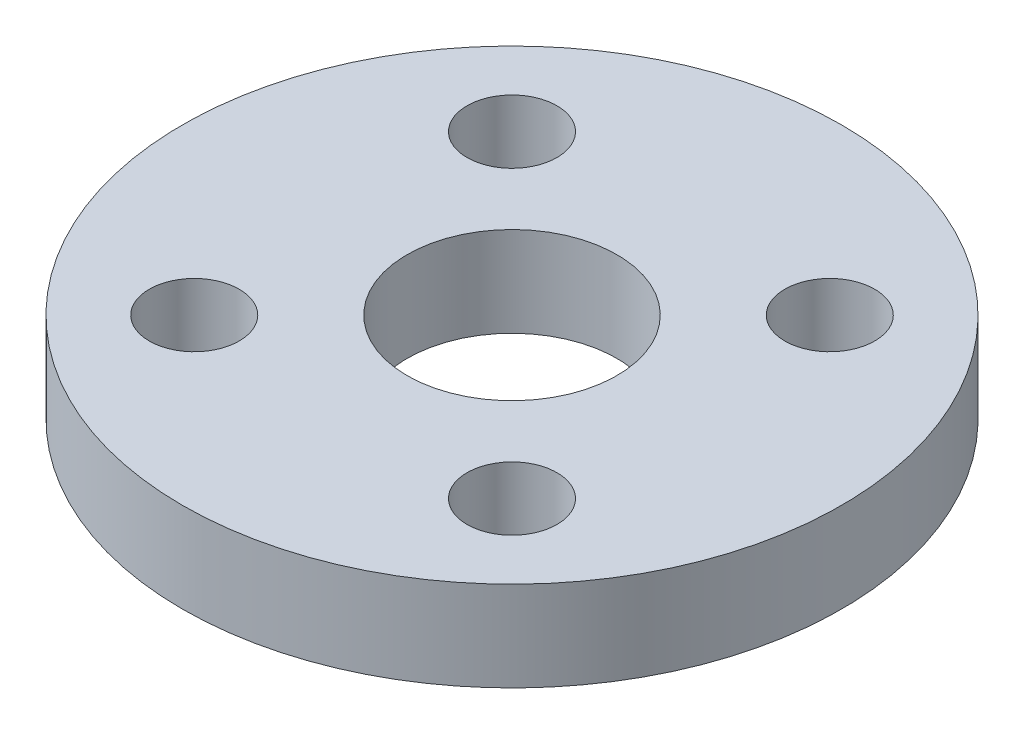
ISO-10303-21;
HEADER;
FILE_DESCRIPTION(('STEP AP214'),'2;1');
FILE_NAME('part.step','',(''),(''),'','','');
FILE_SCHEMA(('AUTOMOTIVE_DESIGN { 1 0 10303 214 1 1 1 1 }'));
ENDSEC;
DATA;
#1=APPLICATION_CONTEXT('core data for automotive mechanical design processes');
#2=APPLICATION_PROTOCOL_DEFINITION('international standard','automotive_design',2000,#1);
#3=PRODUCT_CONTEXT('',#1,'mechanical');
#4=PRODUCT('Part','Part','',(#3));
#5=PRODUCT_RELATED_PRODUCT_CATEGORY('part','',(#4));
#6=PRODUCT_DEFINITION_FORMATION('','',#4);
#7=PRODUCT_DEFINITION_CONTEXT('part definition',#1,'design');
#8=PRODUCT_DEFINITION('design','',#6,#7);
#9=PRODUCT_DEFINITION_SHAPE('','',#8);
#10=(LENGTH_UNIT() NAMED_UNIT(*) SI_UNIT(.MILLI.,.METRE.));
#11=(NAMED_UNIT(*) PLANE_ANGLE_UNIT() SI_UNIT($,.RADIAN.));
#12=(NAMED_UNIT(*) SI_UNIT($,.STERADIAN.) SOLID_ANGLE_UNIT());
#13=UNCERTAINTY_MEASURE_WITH_UNIT(LENGTH_MEASURE(1.E-05),#10,'distance_accuracy_value','');
#14=(GEOMETRIC_REPRESENTATION_CONTEXT(3) GLOBAL_UNCERTAINTY_ASSIGNED_CONTEXT((#13)) GLOBAL_UNIT_ASSIGNED_CONTEXT((#10,
#11,#12)) REPRESENTATION_CONTEXT('',''));
#15=CARTESIAN_POINT('',(0.,0.,0.));
#16=DIRECTION('',(0.,0.,1.));
#17=DIRECTION('',(1.,0.,0.));
#18=AXIS2_PLACEMENT_3D('',#15,#16,#17);
#19=CARTESIAN_POINT('',(0.,3.,0.));
#20=DIRECTION('',(0.,1.,0.));
#21=DIRECTION('',(0.,0.,1.));
#22=AXIS2_PLACEMENT_3D('',#19,#20,#21);
#23=PLANE('',#22);
#24=CARTESIAN_POINT('',(0.,3.,0.));
#25=DIRECTION('',(0.,1.,0.));
#26=DIRECTION('',(0.,0.,1.));
#27=AXIS2_PLACEMENT_3D('',#24,#25,#26);
#28=CIRCLE('',#27,3.5);
#29=CARTESIAN_POINT('',(0.,3.,3.5));
#30=VERTEX_POINT('',#29);
#31=EDGE_CURVE('E79',#30,#30,#28,.T.);
#32=ORIENTED_EDGE('',*,*,#31,.F.);
#33=EDGE_LOOP('',(#32));
#34=FACE_BOUND('',#33,.T.);
#35=CARTESIAN_POINT('',(5.30330085889911,3.,-5.3033008588991));
#36=DIRECTION('',(0.,1.,0.));
#37=DIRECTION('',(0.,0.,1.));
#38=AXIS2_PLACEMENT_3D('',#35,#36,#37);
#39=CIRCLE('',#38,1.5);
#40=CARTESIAN_POINT('',(5.30330085889911,3.,-3.8033008588991));
#41=VERTEX_POINT('',#40);
#42=EDGE_CURVE('E65',#41,#41,#39,.T.);
#43=ORIENTED_EDGE('',*,*,#42,.F.);
#44=EDGE_LOOP('',(#43));
#45=FACE_BOUND('',#44,.T.);
#46=CARTESIAN_POINT('',(-5.30330085889908,3.,5.30330085889913));
#47=DIRECTION('',(0.,1.,0.));
#48=DIRECTION('',(0.,0.,1.));
#49=AXIS2_PLACEMENT_3D('',#46,#47,#48);
#50=CIRCLE('',#49,1.5);
#51=CARTESIAN_POINT('',(-5.30330085889908,3.,6.80330085889913));
#52=VERTEX_POINT('',#51);
#53=EDGE_CURVE('E54',#52,#52,#50,.T.);
#54=ORIENTED_EDGE('',*,*,#53,.F.);
#55=EDGE_LOOP('',(#54));
#56=FACE_BOUND('',#55,.T.);
#57=CARTESIAN_POINT('',(0.,3.,0.));
#58=DIRECTION('',(0.,1.,0.));
#59=DIRECTION('',(0.,0.,1.));
#60=AXIS2_PLACEMENT_3D('',#57,#58,#59);
#61=CIRCLE('',#60,11.);
#62=CARTESIAN_POINT('',(0.,3.,11.));
#63=VERTEX_POINT('',#62);
#64=EDGE_CURVE('E10',#63,#63,#61,.T.);
#65=ORIENTED_EDGE('',*,*,#64,.T.);
#66=EDGE_LOOP('',(#65));
#67=FACE_BOUND('',#66,.T.);
#68=CARTESIAN_POINT('',(-5.30330085889912,3.,-5.30330085889909));
#69=DIRECTION('',(0.,1.,0.));
#70=DIRECTION('',(0.,0.,1.));
#71=AXIS2_PLACEMENT_3D('',#68,#69,#70);
#72=CIRCLE('',#71,1.5);
#73=CARTESIAN_POINT('',(-5.30330085889912,3.,-3.80330085889909));
#74=VERTEX_POINT('',#73);
#75=EDGE_CURVE('E59',#74,#74,#72,.T.);
#76=ORIENTED_EDGE('',*,*,#75,.F.);
#77=EDGE_LOOP('',(#76));
#78=FACE_BOUND('',#77,.T.);
#79=CARTESIAN_POINT('',(5.30330085889908,3.,5.30330085889913));
#80=DIRECTION('',(0.,1.,0.));
#81=DIRECTION('',(0.,0.,1.));
#82=AXIS2_PLACEMENT_3D('',#79,#80,#81);
#83=CIRCLE('',#82,1.5);
#84=CARTESIAN_POINT('',(5.30330085889908,3.,6.80330085889913));
#85=VERTEX_POINT('',#84);
#86=EDGE_CURVE('E71',#85,#85,#83,.T.);
#87=ORIENTED_EDGE('',*,*,#86,.F.);
#88=EDGE_LOOP('',(#87));
#89=FACE_BOUND('',#88,.T.);
#90=ADVANCED_FACE('F41',(#34,#45,#56,#67,#78,#89),#23,.T.);
#91=CARTESIAN_POINT('',(0.,0.,0.));
#92=DIRECTION('',(0.,1.,0.));
#93=DIRECTION('',(0.,0.,1.));
#94=AXIS2_PLACEMENT_3D('',#91,#92,#93);
#95=PLANE('',#94);
#96=CARTESIAN_POINT('',(0.,0.,0.));
#97=DIRECTION('',(0.,1.,0.));
#98=DIRECTION('',(0.,0.,1.));
#99=AXIS2_PLACEMENT_3D('',#96,#97,#98);
#100=CIRCLE('',#99,3.5);
#101=CARTESIAN_POINT('',(0.,0.,3.5));
#102=VERTEX_POINT('',#101);
#103=EDGE_CURVE('E45',#102,#102,#100,.T.);
#104=ORIENTED_EDGE('',*,*,#103,.T.);
#105=EDGE_LOOP('',(#104));
#106=FACE_BOUND('',#105,.T.);
#107=CARTESIAN_POINT('',(0.,0.,0.));
#108=DIRECTION('',(0.,1.,0.));
#109=DIRECTION('',(0.,0.,1.));
#110=AXIS2_PLACEMENT_3D('',#107,#108,#109);
#111=CIRCLE('',#110,11.);
#112=CARTESIAN_POINT('',(0.,0.,11.));
#113=VERTEX_POINT('',#112);
#114=EDGE_CURVE('E49',#113,#113,#111,.T.);
#115=ORIENTED_EDGE('',*,*,#114,.F.);
#116=EDGE_LOOP('',(#115));
#117=FACE_BOUND('',#116,.T.);
#118=CARTESIAN_POINT('',(-5.30330085889908,0.,5.30330085889913));
#119=DIRECTION('',(0.,1.,0.));
#120=DIRECTION('',(0.,0.,1.));
#121=AXIS2_PLACEMENT_3D('',#118,#119,#120);
#122=CIRCLE('',#121,1.5);
#123=CARTESIAN_POINT('',(-5.30330085889908,0.,6.80330085889913));
#124=VERTEX_POINT('',#123);
#125=EDGE_CURVE('E56',#124,#124,#122,.T.);
#126=ORIENTED_EDGE('',*,*,#125,.T.);
#127=EDGE_LOOP('',(#126));
#128=FACE_BOUND('',#127,.T.);
#129=CARTESIAN_POINT('',(-5.30330085889912,0.,-5.30330085889909));
#130=DIRECTION('',(0.,1.,0.));
#131=DIRECTION('',(0.,0.,1.));
#132=AXIS2_PLACEMENT_3D('',#129,#130,#131);
#133=CIRCLE('',#132,1.5);
#134=CARTESIAN_POINT('',(-5.30330085889912,0.,-3.80330085889909));
#135=VERTEX_POINT('',#134);
#136=EDGE_CURVE('E62',#135,#135,#133,.T.);
#137=ORIENTED_EDGE('',*,*,#136,.T.);
#138=EDGE_LOOP('',(#137));
#139=FACE_BOUND('',#138,.T.);
#140=CARTESIAN_POINT('',(5.30330085889911,0.,-5.3033008588991));
#141=DIRECTION('',(0.,1.,0.));
#142=DIRECTION('',(0.,0.,1.));
#143=AXIS2_PLACEMENT_3D('',#140,#141,#142);
#144=CIRCLE('',#143,1.5);
#145=CARTESIAN_POINT('',(5.30330085889911,0.,-3.8033008588991));
#146=VERTEX_POINT('',#145);
#147=EDGE_CURVE('E68',#146,#146,#144,.T.);
#148=ORIENTED_EDGE('',*,*,#147,.T.);
#149=EDGE_LOOP('',(#148));
#150=FACE_BOUND('',#149,.T.);
#151=CARTESIAN_POINT('',(5.30330085889908,0.,5.30330085889913));
#152=DIRECTION('',(0.,1.,0.));
#153=DIRECTION('',(0.,0.,1.));
#154=AXIS2_PLACEMENT_3D('',#151,#152,#153);
#155=CIRCLE('',#154,1.5);
#156=CARTESIAN_POINT('',(5.30330085889908,0.,6.80330085889913));
#157=VERTEX_POINT('',#156);
#158=EDGE_CURVE('E74',#157,#157,#155,.T.);
#159=ORIENTED_EDGE('',*,*,#158,.T.);
#160=EDGE_LOOP('',(#159));
#161=FACE_BOUND('',#160,.T.);
#162=ADVANCED_FACE('F86',(#106,#117,#128,#139,#150,#161),#95,.F.);
#163=CARTESIAN_POINT('',(0.,3.,0.));
#164=DIRECTION('',(0.,-1.,0.));
#165=DIRECTION('',(0.,0.,-1.));
#166=AXIS2_PLACEMENT_3D('',#163,#164,#165);
#167=CYLINDRICAL_SURFACE('',#166,11.);
#168=ORIENTED_EDGE('',*,*,#64,.F.);
#169=EDGE_LOOP('',(#168));
#170=FACE_BOUND('',#169,.T.);
#171=ORIENTED_EDGE('',*,*,#114,.T.);
#172=EDGE_LOOP('',(#171));
#173=FACE_BOUND('',#172,.T.);
#174=ADVANCED_FACE('F43',(#170,#173),#167,.T.);
#175=CARTESIAN_POINT('',(-5.30330085889908,3.,5.30330085889913));
#176=DIRECTION('',(0.,-1.,0.));
#177=DIRECTION('',(0.,0.,-1.));
#178=AXIS2_PLACEMENT_3D('',#175,#176,#177);
#179=CYLINDRICAL_SURFACE('',#178,1.5);
#180=ORIENTED_EDGE('',*,*,#53,.T.);
#181=EDGE_LOOP('',(#180));
#182=FACE_BOUND('',#181,.T.);
#183=ORIENTED_EDGE('',*,*,#125,.F.);
#184=EDGE_LOOP('',(#183));
#185=FACE_BOUND('',#184,.T.);
#186=ADVANCED_FACE('F107',(#182,#185),#179,.F.);
#187=CARTESIAN_POINT('',(-5.30330085889912,3.,-5.30330085889909));
#188=DIRECTION('',(0.,-1.,0.));
#189=DIRECTION('',(0.,0.,-1.));
#190=AXIS2_PLACEMENT_3D('',#187,#188,#189);
#191=CYLINDRICAL_SURFACE('',#190,1.5);
#192=ORIENTED_EDGE('',*,*,#75,.T.);
#193=EDGE_LOOP('',(#192));
#194=FACE_BOUND('',#193,.T.);
#195=ORIENTED_EDGE('',*,*,#136,.F.);
#196=EDGE_LOOP('',(#195));
#197=FACE_BOUND('',#196,.T.);
#198=ADVANCED_FACE('F110',(#194,#197),#191,.F.);
#199=CARTESIAN_POINT('',(5.30330085889911,3.,-5.3033008588991));
#200=DIRECTION('',(0.,-1.,0.));
#201=DIRECTION('',(0.,0.,-1.));
#202=AXIS2_PLACEMENT_3D('',#199,#200,#201);
#203=CYLINDRICAL_SURFACE('',#202,1.5);
#204=ORIENTED_EDGE('',*,*,#42,.T.);
#205=EDGE_LOOP('',(#204));
#206=FACE_BOUND('',#205,.T.);
#207=ORIENTED_EDGE('',*,*,#147,.F.);
#208=EDGE_LOOP('',(#207));
#209=FACE_BOUND('',#208,.T.);
#210=ADVANCED_FACE('F96',(#206,#209),#203,.F.);
#211=CARTESIAN_POINT('',(5.30330085889908,3.,5.30330085889913));
#212=DIRECTION('',(0.,-1.,0.));
#213=DIRECTION('',(0.,0.,-1.));
#214=AXIS2_PLACEMENT_3D('',#211,#212,#213);
#215=CYLINDRICAL_SURFACE('',#214,1.5);
#216=ORIENTED_EDGE('',*,*,#86,.T.);
#217=EDGE_LOOP('',(#216));
#218=FACE_BOUND('',#217,.T.);
#219=ORIENTED_EDGE('',*,*,#158,.F.);
#220=EDGE_LOOP('',(#219));
#221=FACE_BOUND('',#220,.T.);
#222=ADVANCED_FACE('F91',(#218,#221),#215,.F.);
#223=CARTESIAN_POINT('',(0.,-7.,0.));
#224=DIRECTION('',(0.,1.,0.));
#225=DIRECTION('',(0.,0.,1.));
#226=AXIS2_PLACEMENT_3D('',#223,#224,#225);
#227=CYLINDRICAL_SURFACE('',#226,3.5);
#228=ORIENTED_EDGE('',*,*,#31,.T.);
#229=EDGE_LOOP('',(#228));
#230=FACE_BOUND('',#229,.T.);
#231=ORIENTED_EDGE('',*,*,#103,.F.);
#232=EDGE_LOOP('',(#231));
#233=FACE_BOUND('',#232,.T.);
#234=ADVANCED_FACE('F89',(#230,#233),#227,.F.);
#235=CLOSED_SHELL('',(#90,#162,#174,#186,#198,#210,#222,#234));
#236=MANIFOLD_SOLID_BREP('B2',#235);
#237=ADVANCED_BREP_SHAPE_REPRESENTATION('',(#18,#236),#14);
#238=SHAPE_DEFINITION_REPRESENTATION(#9,#237);
ENDSEC;
END-ISO-10303-21;
